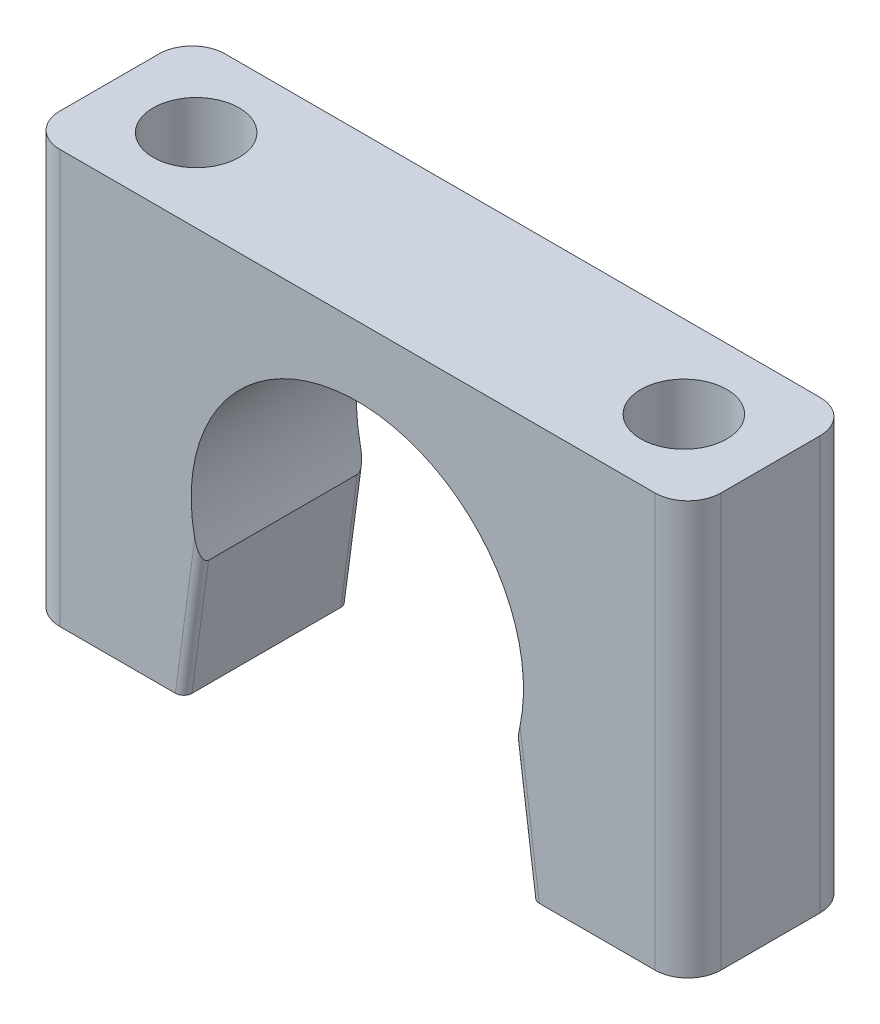
ISO-10303-21;
HEADER;
FILE_DESCRIPTION(('STEP AP214'),'2;1');
FILE_NAME('part.step','',(''),(''),'','','');
FILE_SCHEMA(('AUTOMOTIVE_DESIGN { 1 0 10303 214 1 1 1 1 }'));
ENDSEC;
DATA;
#1=APPLICATION_CONTEXT('core data for automotive mechanical design processes');
#2=APPLICATION_PROTOCOL_DEFINITION('international standard','automotive_design',2000,#1);
#3=PRODUCT_CONTEXT('',#1,'mechanical');
#4=PRODUCT('Part','Part','',(#3));
#5=PRODUCT_RELATED_PRODUCT_CATEGORY('part','',(#4));
#6=PRODUCT_DEFINITION_FORMATION('','',#4);
#7=PRODUCT_DEFINITION_CONTEXT('part definition',#1,'design');
#8=PRODUCT_DEFINITION('design','',#6,#7);
#9=PRODUCT_DEFINITION_SHAPE('','',#8);
#10=(LENGTH_UNIT() NAMED_UNIT(*) SI_UNIT(.MILLI.,.METRE.));
#11=(NAMED_UNIT(*) PLANE_ANGLE_UNIT() SI_UNIT($,.RADIAN.));
#12=(NAMED_UNIT(*) SI_UNIT($,.STERADIAN.) SOLID_ANGLE_UNIT());
#13=UNCERTAINTY_MEASURE_WITH_UNIT(LENGTH_MEASURE(1.E-05),#10,'distance_accuracy_value','');
#14=(GEOMETRIC_REPRESENTATION_CONTEXT(3) GLOBAL_UNCERTAINTY_ASSIGNED_CONTEXT((#13)) GLOBAL_UNIT_ASSIGNED_CONTEXT((#10,
#11,#12)) REPRESENTATION_CONTEXT('',''));
#15=CARTESIAN_POINT('',(0.,0.,0.));
#16=DIRECTION('',(0.,0.,1.));
#17=DIRECTION('',(1.,0.,0.));
#18=AXIS2_PLACEMENT_3D('',#15,#16,#17);
#19=CARTESIAN_POINT('',(-20.,-10.75,10.));
#20=DIRECTION('',(0.,1.,0.));
#21=DIRECTION('',(0.,0.,1.));
#22=AXIS2_PLACEMENT_3D('',#19,#20,#21);
#23=PLANE('',#22);
#24=CARTESIAN_POINT('',(-14.75,-10.75,5.));
#25=DIRECTION('',(0.,-1.,0.));
#26=DIRECTION('',(1.,0.,0.));
#27=AXIS2_PLACEMENT_3D('',#24,#25,#26);
#28=CIRCLE('',#27,2.6);
#29=CARTESIAN_POINT('',(-12.15,-10.75,5.));
#30=VERTEX_POINT('',#29);
#31=EDGE_CURVE('E271',#30,#30,#28,.T.);
#32=ORIENTED_EDGE('',*,*,#31,.F.);
#33=EDGE_LOOP('',(#32));
#34=FACE_BOUND('',#33,.T.);
#35=DIRECTION('',(1.,0.,0.));
#36=VECTOR('',#35,1.);
#37=CARTESIAN_POINT('',(-20.,-10.75,0.));
#38=LINE('',#37,#36);
#39=CARTESIAN_POINT('',(-18.,-10.75,0.));
#40=VERTEX_POINT('',#39);
#41=CARTESIAN_POINT('',(-11.004459250768,-10.75,0.));
#42=VERTEX_POINT('',#41);
#43=EDGE_CURVE('E273',#40,#42,#38,.T.);
#44=ORIENTED_EDGE('',*,*,#43,.T.);
#45=CARTESIAN_POINT('',(-11.004459250768,-10.75,0.5));
#46=DIRECTION('',(0.,1.,0.));
#47=DIRECTION('',(-1.,0.,0.));
#48=AXIS2_PLACEMENT_3D('',#45,#46,#47);
#49=ELLIPSE('',#48,0.504459250767987,0.5);
#50=CARTESIAN_POINT('',(-10.5,-10.75,0.5));
#51=VERTEX_POINT('',#50);
#52=EDGE_CURVE('E57',#42,#51,#49,.F.);
#53=ORIENTED_EDGE('',*,*,#52,.T.);
#54=DIRECTION('',(0.,0.,1.));
#55=VECTOR('',#54,1.);
#56=CARTESIAN_POINT('',(-10.5,-10.75,0.));
#57=LINE('',#56,#55);
#58=CARTESIAN_POINT('',(-10.5,-10.75,9.5));
#59=VERTEX_POINT('',#58);
#60=EDGE_CURVE('E327',#51,#59,#57,.T.);
#61=ORIENTED_EDGE('',*,*,#60,.T.);
#62=CARTESIAN_POINT('',(-11.004459250768,-10.75,9.5));
#63=DIRECTION('',(0.,1.,0.));
#64=DIRECTION('',(1.,0.,0.));
#65=AXIS2_PLACEMENT_3D('',#62,#63,#64);
#66=ELLIPSE('',#65,0.504459250767987,0.5);
#67=CARTESIAN_POINT('',(-11.004459250768,-10.75,10.));
#68=VERTEX_POINT('',#67);
#69=EDGE_CURVE('E49',#59,#68,#66,.F.);
#70=ORIENTED_EDGE('',*,*,#69,.T.);
#71=DIRECTION('',(1.,0.,0.));
#72=VECTOR('',#71,1.);
#73=CARTESIAN_POINT('',(-20.,-10.75,10.));
#74=LINE('',#73,#72);
#75=CARTESIAN_POINT('',(-18.,-10.75,10.));
#76=VERTEX_POINT('',#75);
#77=EDGE_CURVE('E293',#76,#68,#74,.T.);
#78=ORIENTED_EDGE('',*,*,#77,.F.);
#79=CARTESIAN_POINT('',(-18.,-10.75,8.));
#80=DIRECTION('',(0.,1.,0.));
#81=DIRECTION('',(0.,0.,1.));
#82=AXIS2_PLACEMENT_3D('',#79,#80,#81);
#83=CIRCLE('',#82,2.);
#84=CARTESIAN_POINT('',(-20.,-10.75,8.));
#85=VERTEX_POINT('',#84);
#86=EDGE_CURVE('E206',#76,#85,#83,.F.);
#87=ORIENTED_EDGE('',*,*,#86,.T.);
#88=DIRECTION('',(0.,0.,-1.));
#89=VECTOR('',#88,1.);
#90=CARTESIAN_POINT('',(-20.,-10.75,10.));
#91=LINE('',#90,#89);
#92=CARTESIAN_POINT('',(-20.,-10.75,2.));
#93=VERTEX_POINT('',#92);
#94=EDGE_CURVE('E294',#85,#93,#91,.T.);
#95=ORIENTED_EDGE('',*,*,#94,.T.);
#96=CARTESIAN_POINT('',(-18.,-10.75,2.));
#97=DIRECTION('',(0.,1.,0.));
#98=DIRECTION('',(0.,0.,1.));
#99=AXIS2_PLACEMENT_3D('',#96,#97,#98);
#100=CIRCLE('',#99,2.);
#101=EDGE_CURVE('E208',#93,#40,#100,.F.);
#102=ORIENTED_EDGE('',*,*,#101,.T.);
#103=EDGE_LOOP('',(#44,#53,#61,#70,#78,#87,#95,#102));
#104=FACE_BOUND('',#103,.T.);
#105=ADVANCED_FACE('F33',(#34,#104),#23,.F.);
#106=CARTESIAN_POINT('',(0.,0.,10.));
#107=DIRECTION('',(0.,0.,-1.));
#108=DIRECTION('',(-1.,0.,0.));
#109=AXIS2_PLACEMENT_3D('',#106,#107,#108);
#110=CYLINDRICAL_SURFACE('',#109,10.05);
#111=DIRECTION('',(0.,0.,-1.));
#112=VECTOR('',#111,1.);
#113=CARTESIAN_POINT('',(9.5,-3.27910048641391,10.));
#114=LINE('',#113,#112);
#115=CARTESIAN_POINT('',(9.5,-3.27910048641391,9.5));
#116=VERTEX_POINT('',#115);
#117=CARTESIAN_POINT('',(9.5,-3.27910048641391,0.5));
#118=VERTEX_POINT('',#117);
#119=EDGE_CURVE('E181',#116,#118,#114,.T.);
#120=ORIENTED_EDGE('',*,*,#119,.F.);
#121=CARTESIAN_POINT('',(9.5,-3.27910048641391,9.5));
#122=CARTESIAN_POINT('',(9.49998790671748,-3.27913316372702,9.51372534374378));
#123=CARTESIAN_POINT('',(9.50041030015473,-3.27791188653115,9.52740611635836));
#124=CARTESIAN_POINT('',(9.50201354953025,-3.27326264925061,9.55419190295349));
#125=CARTESIAN_POINT('',(9.50318597417995,-3.26985921835856,9.56730160814837));
#126=CARTESIAN_POINT('',(9.50652691985815,-3.2601343519518,9.59569952276108));
#127=CARTESIAN_POINT('',(9.50886227788309,-3.25332253900196,9.61079733503215));
#128=CARTESIAN_POINT('',(9.51427360118032,-3.23746334044807,9.63967133468617));
#129=CARTESIAN_POINT('',(9.51735289817296,-3.22840589287224,9.65344117520825));
#130=CARTESIAN_POINT('',(9.52589825161446,-3.20312715234871,9.68692330463747));
#131=CARTESIAN_POINT('',(9.53173536845415,-3.18573412128364,9.70564641602022));
#132=CARTESIAN_POINT('',(9.54409715914862,-3.14850722177467,9.74016843318304));
#133=CARTESIAN_POINT('',(9.5506232127815,-3.12866844121554,9.75596128909435));
#134=CARTESIAN_POINT('',(9.56378659448417,-3.08819076170209,9.78458290250436));
#135=CARTESIAN_POINT('',(9.57041075993641,-3.06760905108045,9.79750004627292));
#136=CARTESIAN_POINT('',(9.58382784219067,-3.0254315345143,9.82147299756049));
#137=CARTESIAN_POINT('',(9.59062091321052,-3.00383478448872,9.832527026573));
#138=CARTESIAN_POINT('',(9.61110479314627,-2.93790341987511,9.86338335130602));
#139=CARTESIAN_POINT('',(9.62487742882602,-2.8924975538443,9.88083429173306));
#140=CARTESIAN_POINT('',(9.65391533866754,-2.79417027429258,9.91307361387059));
#141=CARTESIAN_POINT('',(9.66914230546211,-2.74103836291234,9.92722234704051));
#142=CARTESIAN_POINT('',(9.6989657052255,-2.63356786409729,9.9510726919415));
#143=CARTESIAN_POINT('',(9.71356134241276,-2.5792278773649,9.9607688311759));
#144=CARTESIAN_POINT('',(9.74195527110588,-2.46981889444103,9.97661751859578));
#145=CARTESIAN_POINT('',(9.75575318921508,-2.41474957144913,9.98276841921504));
#146=CARTESIAN_POINT('',(9.78246529527098,-2.30415056021506,9.99215968215052));
#147=CARTESIAN_POINT('',(9.79537938279366,-2.2486208204597,9.99539971422889));
#148=CARTESIAN_POINT('',(9.81328579092678,-2.16853600687063,9.99829615251529));
#149=CARTESIAN_POINT('',(9.81865483182815,-2.14409509894796,9.99894324196794));
#150=CARTESIAN_POINT('',(9.82919753406424,-2.09523237287896,9.99979440023426));
#151=CARTESIAN_POINT('',(9.83437168315515,-2.07081068093855,9.99999965882678));
#152=CARTESIAN_POINT('',(9.83945487780237,-2.04636939668552,10.));
#153=B_SPLINE_CURVE_WITH_KNOTS('',3,(#121,#122,#123,#124,#125,#126,#127,#128,#129,#130,#131,
#132,#133,#134,#135,#136,#137,#138,#139,#140,#141,#142,#143,#144,#145,#146,#147,#148,#149,#150,
#151,#152),.UNSPECIFIED.,.F.,.F.,(4,2,2,2,2,2,2,2,2,2,2,2,2,2,2,4),(0.,0.0410432505747204,
0.0816330425823074,0.13153684270174,0.18166842004176,0.259866945468589,0.338225167138012,
0.413669487935746,0.489185424005445,0.640474285918973,0.811401163055235,0.982537560661458,
1.15375342588844,1.32498871309231,1.40008139095695,1.47497160213267),.UNSPECIFIED.);
#154=CARTESIAN_POINT('',(9.83945487780237,-2.04636939668552,10.));
#155=VERTEX_POINT('',#154);
#156=EDGE_CURVE('E244',#116,#155,#153,.T.);
#157=ORIENTED_EDGE('',*,*,#156,.T.);
#158=CARTESIAN_POINT('',(0.,0.,10.));
#159=DIRECTION('',(0.,0.,-1.));
#160=DIRECTION('',(1.,0.,0.));
#161=AXIS2_PLACEMENT_3D('',#158,#159,#160);
#162=CIRCLE('',#161,10.05);
#163=CARTESIAN_POINT('',(-9.83945487780237,-2.04636939668551,10.));
#164=VERTEX_POINT('',#163);
#165=EDGE_CURVE('E344',#164,#155,#162,.T.);
#166=ORIENTED_EDGE('',*,*,#165,.F.);
#167=CARTESIAN_POINT('',(-9.83945487780237,-2.04636939668551,10.));
#168=CARTESIAN_POINT('',(-9.82689287255356,-2.10678373649763,9.9999688619861));
#169=CARTESIAN_POINT('',(-9.81376299556602,-2.16711170176037,9.9987391228412));
#170=CARTESIAN_POINT('',(-9.78637742552928,-2.28760438592438,9.99327890987156));
#171=CARTESIAN_POINT('',(-9.77211776204025,-2.347767683996,9.9890373947442));
#172=CARTESIAN_POINT('',(-9.74266098100099,-2.46714775672689,9.97697630622118));
#173=CARTESIAN_POINT('',(-9.72746972832768,-2.52636798545276,9.96917745695797));
#174=CARTESIAN_POINT('',(-9.69622395214052,-2.64375037325262,9.94911813473575));
#175=CARTESIAN_POINT('',(-9.68017090937881,-2.70191413105831,9.93686511834777));
#176=CARTESIAN_POINT('',(-9.65423213761228,-2.79276212778526,9.91279973236236));
#177=CARTESIAN_POINT('',(-9.64454990415788,-2.82600886140964,9.90291231627503));
#178=CARTESIAN_POINT('',(-9.62502140542735,-2.89182478534859,9.88064420577114));
#179=CARTESIAN_POINT('',(-9.6151745304631,-2.92438923618497,9.86825008079128));
#180=CARTESIAN_POINT('',(-9.59224225415447,-2.99889134294011,9.83580134353254));
#181=CARTESIAN_POINT('',(-9.57916519492212,-3.04035831008542,9.81456926728568));
#182=CARTESIAN_POINT('',(-9.56025654380345,-3.09910017874477,9.77720428699389));
#183=CARTESIAN_POINT('',(-9.55409038046742,-3.1180483633034,9.76388194027836));
#184=CARTESIAN_POINT('',(-9.54218182108432,-3.154302713136,9.73502553052636));
#185=CARTESIAN_POINT('',(-9.53643844782512,-3.17161269314652,9.71949682745566));
#186=CARTESIAN_POINT('',(-9.52732699994715,-3.19885609019244,9.69097290152354));
#187=CARTESIAN_POINT('',(-9.52376926569638,-3.20942760505898,9.67865277517425));
#188=CARTESIAN_POINT('',(-9.51716490572398,-3.22895929539167,9.65262861625089));
#189=CARTESIAN_POINT('',(-9.51411866658142,-3.23791825247954,9.63892354938187));
#190=CARTESIAN_POINT('',(-9.50871779825588,-3.25374508252056,9.60994267876574));
#191=CARTESIAN_POINT('',(-9.50637351165849,-3.26058173448216,9.5946474747869));
#192=CARTESIAN_POINT('',(-9.50270520108838,-3.27125771002962,9.56294548994908));
#193=CARTESIAN_POINT('',(-9.50137696120834,-3.27510941998869,9.5465436130279));
#194=CARTESIAN_POINT('',(-9.50043504891646,-3.27783984453272,9.52496497354879));
#195=CARTESIAN_POINT('',(-9.50027225057644,-3.27831164170563,9.51998624689404));
#196=CARTESIAN_POINT('',(-9.50005479386851,-3.27894176252967,9.51000594215666));
#197=CARTESIAN_POINT('',(-9.50000015094776,-3.27910004140301,9.50500436091209));
#198=CARTESIAN_POINT('',(-9.5,-3.27910048641395,9.50000000000001));
#199=B_SPLINE_CURVE_WITH_KNOTS('',3,(#167,#168,#169,#170,#171,#172,#173,#174,#175,#176,#177,
#178,#179,#180,#181,#182,#183,#184,#185,#186,#187,#188,#189,#190,#191,#192,#193,#194,#195,#196,
#197,#198),.UNSPECIFIED.,.F.,.F.,(4,2,2,2,2,2,2,2,2,2,2,2,2,2,2,4),(0.,0.185153588946186,
0.370989487078372,0.55575631321418,0.740215241244101,0.848170250899866,0.956719765882345,
1.10124745107238,1.17304630294399,1.24467362292246,1.29442109380783,1.34420599536025,
1.39469192029021,1.44496720909608,1.45996989148548,1.47497471645699),.UNSPECIFIED.);
#200=CARTESIAN_POINT('',(-9.5,-3.27910048641391,9.5));
#201=VERTEX_POINT('',#200);
#202=EDGE_CURVE('E215',#164,#201,#199,.T.);
#203=ORIENTED_EDGE('',*,*,#202,.T.);
#204=DIRECTION('',(0.,0.,-1.));
#205=VECTOR('',#204,1.);
#206=CARTESIAN_POINT('',(-9.5,-3.27910048641391,10.));
#207=LINE('',#206,#205);
#208=CARTESIAN_POINT('',(-9.5,-3.27910048641391,0.5));
#209=VERTEX_POINT('',#208);
#210=EDGE_CURVE('E176',#201,#209,#207,.T.);
#211=ORIENTED_EDGE('',*,*,#210,.T.);
#212=CARTESIAN_POINT('',(-9.5,-3.27910048641391,0.5));
#213=CARTESIAN_POINT('',(-9.49998790671748,-3.27913316372702,0.486274656256216));
#214=CARTESIAN_POINT('',(-9.50041030015473,-3.27791188653115,0.472593883641635));
#215=CARTESIAN_POINT('',(-9.50201354953025,-3.2732626492506,0.445808097046511));
#216=CARTESIAN_POINT('',(-9.50318597417995,-3.26985921835855,0.432698391851632));
#217=CARTESIAN_POINT('',(-9.50652691985816,-3.26013435195179,0.404300477238918));
#218=CARTESIAN_POINT('',(-9.5088622778831,-3.25332253900196,0.389202664967854));
#219=CARTESIAN_POINT('',(-9.51427360118033,-3.23746334044806,0.360328665313829));
#220=CARTESIAN_POINT('',(-9.51735289817296,-3.22840589287224,0.346558824791753));
#221=CARTESIAN_POINT('',(-9.52589825161446,-3.20312715234871,0.313076695362534));
#222=CARTESIAN_POINT('',(-9.53173536845415,-3.18573412128363,0.294353583979787));
#223=CARTESIAN_POINT('',(-9.54409715914862,-3.14850722177466,0.259831566816961));
#224=CARTESIAN_POINT('',(-9.5506232127815,-3.12866844121553,0.244038710905652));
#225=CARTESIAN_POINT('',(-9.56378659448417,-3.08819076170209,0.215417097495638));
#226=CARTESIAN_POINT('',(-9.57041075993641,-3.06760905108044,0.202499953727085));
#227=CARTESIAN_POINT('',(-9.58382784219067,-3.0254315345143,0.17852700243951));
#228=CARTESIAN_POINT('',(-9.59062091321052,-3.00383478448872,0.167472973427007));
#229=CARTESIAN_POINT('',(-9.61110479314627,-2.9379034198751,0.136616648693988));
#230=CARTESIAN_POINT('',(-9.62487742882602,-2.8924975538443,0.119165708266946));
#231=CARTESIAN_POINT('',(-9.65391533866754,-2.79417027429258,0.0869263861294149));
#232=CARTESIAN_POINT('',(-9.66914230546211,-2.74103836291234,0.0727776529594946));
#233=CARTESIAN_POINT('',(-9.6989657052255,-2.63356786409729,0.0489273080585019));
#234=CARTESIAN_POINT('',(-9.71356134241276,-2.5792278773649,0.0392311688241016));
#235=CARTESIAN_POINT('',(-9.74195527110588,-2.46981889444103,0.0233824814042255));
#236=CARTESIAN_POINT('',(-9.75575318921508,-2.41474957144913,0.0172315807849641));
#237=CARTESIAN_POINT('',(-9.78246529527098,-2.30415056021507,0.00784031784948217));
#238=CARTESIAN_POINT('',(-9.79537938279366,-2.24862082045971,0.00460028577111025));
#239=CARTESIAN_POINT('',(-9.81328579092678,-2.16853600687064,0.00170384748470681));
#240=CARTESIAN_POINT('',(-9.81865483182815,-2.14409509894796,0.00105675803205909));
#241=CARTESIAN_POINT('',(-9.82919753406424,-2.09523237287896,0.000205599765735223));
#242=CARTESIAN_POINT('',(-9.83437168315515,-2.07081068093854,3.41173226165158E-07));
#243=CARTESIAN_POINT('',(-9.83945487780237,-2.04636939668551,0.));
#244=B_SPLINE_CURVE_WITH_KNOTS('',3,(#212,#213,#214,#215,#216,#217,#218,#219,#220,#221,#222,
#223,#224,#225,#226,#227,#228,#229,#230,#231,#232,#233,#234,#235,#236,#237,#238,#239,#240,#241,
#242,#243),.UNSPECIFIED.,.F.,.F.,(4,2,2,2,2,2,2,2,2,2,2,2,2,2,2,4),(0.,0.0410432505747221,
0.0816330425823075,0.131536842701741,0.18166842004176,0.259866945468588,0.338225167138009,
0.413669487935741,0.48918542400544,0.640474285918965,0.811401163055226,0.982537560661448,
1.15375342588843,1.3249887130923,1.40008139095695,1.47497160213267),.UNSPECIFIED.);
#245=CARTESIAN_POINT('',(-9.83945487780237,-2.04636939668551,0.));
#246=VERTEX_POINT('',#245);
#247=EDGE_CURVE('E221',#209,#246,#244,.T.);
#248=ORIENTED_EDGE('',*,*,#247,.T.);
#249=CARTESIAN_POINT('',(0.,0.,0.));
#250=DIRECTION('',(0.,0.,-1.));
#251=DIRECTION('',(1.,0.,0.));
#252=AXIS2_PLACEMENT_3D('',#249,#250,#251);
#253=CIRCLE('',#252,10.05);
#254=CARTESIAN_POINT('',(9.83945487780237,-2.04636939668552,0.));
#255=VERTEX_POINT('',#254);
#256=EDGE_CURVE('E278',#246,#255,#253,.T.);
#257=ORIENTED_EDGE('',*,*,#256,.T.);
#258=CARTESIAN_POINT('',(9.83945487780237,-2.04636939668552,0.));
#259=CARTESIAN_POINT('',(9.82689287255356,-2.10678373649764,3.11380139014351E-05));
#260=CARTESIAN_POINT('',(9.81376299556601,-2.16711170176038,0.00126087715880306));
#261=CARTESIAN_POINT('',(9.78637742552928,-2.28760438592438,0.0067210901284361));
#262=CARTESIAN_POINT('',(9.77211776204025,-2.347767683996,0.0109626052558032));
#263=CARTESIAN_POINT('',(9.74266098100099,-2.46714775672689,0.0230236937788195));
#264=CARTESIAN_POINT('',(9.72746972832768,-2.52636798545276,0.030822543042026));
#265=CARTESIAN_POINT('',(9.69622395214052,-2.64375037325262,0.0508818652642507));
#266=CARTESIAN_POINT('',(9.68017090937881,-2.70191413105831,0.0631348816522322));
#267=CARTESIAN_POINT('',(9.65423213761228,-2.79276212778527,0.0872002676376376));
#268=CARTESIAN_POINT('',(9.64454990415787,-2.82600886140965,0.0970876837249674));
#269=CARTESIAN_POINT('',(9.62502140542735,-2.89182478534859,0.119355794228859));
#270=CARTESIAN_POINT('',(9.6151745304631,-2.92438923618498,0.131749919208722));
#271=CARTESIAN_POINT('',(9.59224225415446,-2.99889134294012,0.164198656467458));
#272=CARTESIAN_POINT('',(9.57916519492212,-3.04035831008542,0.185430732714321));
#273=CARTESIAN_POINT('',(9.56025654380345,-3.09910017874477,0.222795713006106));
#274=CARTESIAN_POINT('',(9.55409038046742,-3.1180483633034,0.236118059721634));
#275=CARTESIAN_POINT('',(9.54218182108432,-3.154302713136,0.264974469473639));
#276=CARTESIAN_POINT('',(9.53643844782512,-3.17161269314652,0.280503172544334));
#277=CARTESIAN_POINT('',(9.52732699994715,-3.19885609019244,0.309027098476459));
#278=CARTESIAN_POINT('',(9.52376926569638,-3.20942760505898,0.321347224825745));
#279=CARTESIAN_POINT('',(9.51716490572398,-3.22895929539167,0.347371383749108));
#280=CARTESIAN_POINT('',(9.51411866658142,-3.23791825247955,0.361076450618122));
#281=CARTESIAN_POINT('',(9.50871779825588,-3.25374508252056,0.390057321234257));
#282=CARTESIAN_POINT('',(9.50637351165849,-3.26058173448216,0.405352525213093));
#283=CARTESIAN_POINT('',(9.50270520108838,-3.27125771002962,0.43705451005092));
#284=CARTESIAN_POINT('',(9.50137696120834,-3.27510941998869,0.453456386972097));
#285=CARTESIAN_POINT('',(9.50043504891646,-3.27783984453272,0.475035026451206));
#286=CARTESIAN_POINT('',(9.50027225057644,-3.27831164170563,0.480013753105957));
#287=CARTESIAN_POINT('',(9.50005479386851,-3.27894176252968,0.489994057843337));
#288=CARTESIAN_POINT('',(9.50000015094776,-3.27910004140302,0.494995639087909));
#289=CARTESIAN_POINT('',(9.5,-3.27910048641396,0.499999999999994));
#290=B_SPLINE_CURVE_WITH_KNOTS('',3,(#258,#259,#260,#261,#262,#263,#264,#265,#266,#267,#268,
#269,#270,#271,#272,#273,#274,#275,#276,#277,#278,#279,#280,#281,#282,#283,#284,#285,#286,#287,
#288,#289),.UNSPECIFIED.,.F.,.F.,(4,2,2,2,2,2,2,2,2,2,2,2,2,2,2,4),(0.,0.185153588946184,
0.370989487078369,0.555756313214177,0.740215241244099,0.848170250899866,0.956719765882346,
1.10124745107238,1.17304630294398,1.24467362292245,1.29442109380782,1.34420599536024,
1.3946919202902,1.44496720909607,1.45996989148547,1.47497471645699),.UNSPECIFIED.);
#291=EDGE_CURVE('E239',#255,#118,#290,.T.);
#292=ORIENTED_EDGE('',*,*,#291,.T.);
#293=EDGE_LOOP('',(#120,#157,#166,#203,#211,#248,#257,#292));
#294=FACE_BOUND('',#293,.T.);
#295=ADVANCED_FACE('F226',(#294),#110,.F.);
#296=CARTESIAN_POINT('',(9.5,-10.75,10.));
#297=DIRECTION('',(0.,1.,0.));
#298=DIRECTION('',(-1.,0.,0.));
#299=AXIS2_PLACEMENT_3D('',#296,#297,#298);
#300=PLANE('',#299);
#301=CARTESIAN_POINT('',(14.75,-10.75,5.));
#302=DIRECTION('',(0.,-1.,0.));
#303=DIRECTION('',(1.,0.,0.));
#304=AXIS2_PLACEMENT_3D('',#301,#302,#303);
#305=CIRCLE('',#304,2.6);
#306=CARTESIAN_POINT('',(17.35,-10.75,5.));
#307=VERTEX_POINT('',#306);
#308=EDGE_CURVE('E332',#307,#307,#305,.T.);
#309=ORIENTED_EDGE('',*,*,#308,.F.);
#310=EDGE_LOOP('',(#309));
#311=FACE_BOUND('',#310,.T.);
#312=DIRECTION('',(1.,0.,0.));
#313=VECTOR('',#312,1.);
#314=CARTESIAN_POINT('',(9.5,-10.75,10.));
#315=LINE('',#314,#313);
#316=CARTESIAN_POINT('',(11.004459250768,-10.75,10.));
#317=VERTEX_POINT('',#316);
#318=CARTESIAN_POINT('',(18.,-10.75,10.));
#319=VERTEX_POINT('',#318);
#320=EDGE_CURVE('E346',#317,#319,#315,.T.);
#321=ORIENTED_EDGE('',*,*,#320,.F.);
#322=CARTESIAN_POINT('',(11.004459250768,-10.75,9.5));
#323=DIRECTION('',(0.,1.,0.));
#324=DIRECTION('',(1.,0.,0.));
#325=AXIS2_PLACEMENT_3D('',#322,#323,#324);
#326=ELLIPSE('',#325,0.504459250767987,0.5);
#327=CARTESIAN_POINT('',(10.5,-10.75,9.5));
#328=VERTEX_POINT('',#327);
#329=EDGE_CURVE('E313',#317,#328,#326,.F.);
#330=ORIENTED_EDGE('',*,*,#329,.T.);
#331=DIRECTION('',(0.,0.,1.));
#332=VECTOR('',#331,1.);
#333=CARTESIAN_POINT('',(10.5,-10.75,0.));
#334=LINE('',#333,#332);
#335=CARTESIAN_POINT('',(10.5,-10.75,0.5));
#336=VERTEX_POINT('',#335);
#337=EDGE_CURVE('E333',#336,#328,#334,.T.);
#338=ORIENTED_EDGE('',*,*,#337,.F.);
#339=CARTESIAN_POINT('',(11.004459250768,-10.75,0.5));
#340=DIRECTION('',(0.,1.,0.));
#341=DIRECTION('',(-1.,0.,0.));
#342=AXIS2_PLACEMENT_3D('',#339,#340,#341);
#343=ELLIPSE('',#342,0.504459250767987,0.5);
#344=CARTESIAN_POINT('',(11.004459250768,-10.75,0.));
#345=VERTEX_POINT('',#344);
#346=EDGE_CURVE('E309',#336,#345,#343,.F.);
#347=ORIENTED_EDGE('',*,*,#346,.T.);
#348=DIRECTION('',(1.,0.,0.));
#349=VECTOR('',#348,1.);
#350=CARTESIAN_POINT('',(9.5,-10.75,0.));
#351=LINE('',#350,#349);
#352=CARTESIAN_POINT('',(18.,-10.75,0.));
#353=VERTEX_POINT('',#352);
#354=EDGE_CURVE('E282',#345,#353,#351,.T.);
#355=ORIENTED_EDGE('',*,*,#354,.T.);
#356=CARTESIAN_POINT('',(18.,-10.75,2.));
#357=DIRECTION('',(0.,1.,0.));
#358=DIRECTION('',(-1.,0.,0.));
#359=AXIS2_PLACEMENT_3D('',#356,#357,#358);
#360=CIRCLE('',#359,2.);
#361=CARTESIAN_POINT('',(20.,-10.75,2.));
#362=VERTEX_POINT('',#361);
#363=EDGE_CURVE('E194',#353,#362,#360,.F.);
#364=ORIENTED_EDGE('',*,*,#363,.T.);
#365=DIRECTION('',(0.,0.,-1.));
#366=VECTOR('',#365,1.);
#367=CARTESIAN_POINT('',(20.,-10.75,10.));
#368=LINE('',#367,#366);
#369=CARTESIAN_POINT('',(20.,-10.75,8.));
#370=VERTEX_POINT('',#369);
#371=EDGE_CURVE('E169',#370,#362,#368,.T.);
#372=ORIENTED_EDGE('',*,*,#371,.F.);
#373=CARTESIAN_POINT('',(18.,-10.75,8.));
#374=DIRECTION('',(0.,1.,0.));
#375=DIRECTION('',(-1.,0.,0.));
#376=AXIS2_PLACEMENT_3D('',#373,#374,#375);
#377=CIRCLE('',#376,2.);
#378=EDGE_CURVE('E175',#370,#319,#377,.F.);
#379=ORIENTED_EDGE('',*,*,#378,.T.);
#380=EDGE_LOOP('',(#321,#330,#338,#347,#355,#364,#372,#379));
#381=FACE_BOUND('',#380,.T.);
#382=ADVANCED_FACE('F231',(#311,#381),#300,.F.);
#383=CARTESIAN_POINT('',(20.,-10.75,10.));
#384=DIRECTION('',(-1.,0.,0.));
#385=DIRECTION('',(0.,-1.,0.));
#386=AXIS2_PLACEMENT_3D('',#383,#384,#385);
#387=PLANE('',#386);
#388=ORIENTED_EDGE('',*,*,#371,.T.);
#389=DIRECTION('',(0.,1.,0.));
#390=VECTOR('',#389,1.);
#391=CARTESIAN_POINT('',(20.,-10.75,2.));
#392=LINE('',#391,#390);
#393=CARTESIAN_POINT('',(20.,14.25,2.));
#394=VERTEX_POINT('',#393);
#395=EDGE_CURVE('E168',#362,#394,#392,.T.);
#396=ORIENTED_EDGE('',*,*,#395,.T.);
#397=DIRECTION('',(0.,0.,-1.));
#398=VECTOR('',#397,1.);
#399=CARTESIAN_POINT('',(20.,14.25,10.));
#400=LINE('',#399,#398);
#401=CARTESIAN_POINT('',(20.,14.25,8.));
#402=VERTEX_POINT('',#401);
#403=EDGE_CURVE('E151',#402,#394,#400,.T.);
#404=ORIENTED_EDGE('',*,*,#403,.F.);
#405=DIRECTION('',(0.,1.,0.));
#406=VECTOR('',#405,1.);
#407=CARTESIAN_POINT('',(20.,-10.75,8.));
#408=LINE('',#407,#406);
#409=EDGE_CURVE('E165',#402,#370,#408,.F.);
#410=ORIENTED_EDGE('',*,*,#409,.T.);
#411=EDGE_LOOP('',(#388,#396,#404,#410));
#412=FACE_BOUND('',#411,.T.);
#413=ADVANCED_FACE('F164',(#412),#387,.F.);
#414=CARTESIAN_POINT('',(-20.,14.25,10.));
#415=DIRECTION('',(0.,-1.,0.));
#416=DIRECTION('',(0.,0.,-1.));
#417=AXIS2_PLACEMENT_3D('',#414,#415,#416);
#418=PLANE('',#417);
#419=CARTESIAN_POINT('',(14.75,14.25,5.));
#420=DIRECTION('',(0.,-1.,0.));
#421=DIRECTION('',(1.,0.,0.));
#422=AXIS2_PLACEMENT_3D('',#419,#420,#421);
#423=CIRCLE('',#422,2.6);
#424=CARTESIAN_POINT('',(17.35,14.25,5.));
#425=VERTEX_POINT('',#424);
#426=EDGE_CURVE('E336',#425,#425,#423,.T.);
#427=ORIENTED_EDGE('',*,*,#426,.T.);
#428=EDGE_LOOP('',(#427));
#429=FACE_BOUND('',#428,.T.);
#430=CARTESIAN_POINT('',(-14.75,14.25,5.));
#431=DIRECTION('',(0.,-1.,0.));
#432=DIRECTION('',(1.,0.,0.));
#433=AXIS2_PLACEMENT_3D('',#430,#431,#432);
#434=CIRCLE('',#433,2.6);
#435=CARTESIAN_POINT('',(-12.15,14.25,5.));
#436=VERTEX_POINT('',#435);
#437=EDGE_CURVE('E279',#436,#436,#434,.T.);
#438=ORIENTED_EDGE('',*,*,#437,.T.);
#439=EDGE_LOOP('',(#438));
#440=FACE_BOUND('',#439,.T.);
#441=ORIENTED_EDGE('',*,*,#403,.T.);
#442=CARTESIAN_POINT('',(18.,14.25,2.));
#443=DIRECTION('',(0.,-1.,0.));
#444=DIRECTION('',(0.,0.,-1.));
#445=AXIS2_PLACEMENT_3D('',#442,#443,#444);
#446=CIRCLE('',#445,2.);
#447=CARTESIAN_POINT('',(18.,14.25,0.));
#448=VERTEX_POINT('',#447);
#449=EDGE_CURVE('E158',#394,#448,#446,.F.);
#450=ORIENTED_EDGE('',*,*,#449,.T.);
#451=DIRECTION('',(-1.,0.,0.));
#452=VECTOR('',#451,1.);
#453=CARTESIAN_POINT('',(-20.,14.25,0.));
#454=LINE('',#453,#452);
#455=CARTESIAN_POINT('',(-18.,14.25,0.));
#456=VERTEX_POINT('',#455);
#457=EDGE_CURVE('E290',#448,#456,#454,.T.);
#458=ORIENTED_EDGE('',*,*,#457,.T.);
#459=CARTESIAN_POINT('',(-18.,14.25,2.));
#460=DIRECTION('',(0.,-1.,0.));
#461=DIRECTION('',(0.,0.,-1.));
#462=AXIS2_PLACEMENT_3D('',#459,#460,#461);
#463=CIRCLE('',#462,2.);
#464=CARTESIAN_POINT('',(-20.,14.25,2.));
#465=VERTEX_POINT('',#464);
#466=EDGE_CURVE('E159',#456,#465,#463,.F.);
#467=ORIENTED_EDGE('',*,*,#466,.T.);
#468=DIRECTION('',(0.,0.,-1.));
#469=VECTOR('',#468,1.);
#470=CARTESIAN_POINT('',(-20.,14.25,10.));
#471=LINE('',#470,#469);
#472=CARTESIAN_POINT('',(-20.,14.25,8.));
#473=VERTEX_POINT('',#472);
#474=EDGE_CURVE('E170',#473,#465,#471,.T.);
#475=ORIENTED_EDGE('',*,*,#474,.F.);
#476=CARTESIAN_POINT('',(-18.,14.25,8.));
#477=DIRECTION('',(0.,-1.,0.));
#478=DIRECTION('',(0.,0.,-1.));
#479=AXIS2_PLACEMENT_3D('',#476,#477,#478);
#480=CIRCLE('',#479,2.);
#481=CARTESIAN_POINT('',(-18.,14.25,10.));
#482=VERTEX_POINT('',#481);
#483=EDGE_CURVE('E178',#473,#482,#480,.F.);
#484=ORIENTED_EDGE('',*,*,#483,.T.);
#485=DIRECTION('',(-1.,0.,0.));
#486=VECTOR('',#485,1.);
#487=CARTESIAN_POINT('',(-20.,14.25,10.));
#488=LINE('',#487,#486);
#489=CARTESIAN_POINT('',(18.,14.25,10.));
#490=VERTEX_POINT('',#489);
#491=EDGE_CURVE('E153',#490,#482,#488,.T.);
#492=ORIENTED_EDGE('',*,*,#491,.F.);
#493=CARTESIAN_POINT('',(18.,14.25,8.));
#494=DIRECTION('',(0.,-1.,0.));
#495=DIRECTION('',(0.,0.,-1.));
#496=AXIS2_PLACEMENT_3D('',#493,#494,#495);
#497=CIRCLE('',#496,2.);
#498=EDGE_CURVE('E148',#490,#402,#497,.F.);
#499=ORIENTED_EDGE('',*,*,#498,.T.);
#500=EDGE_LOOP('',(#441,#450,#458,#467,#475,#484,#492,#499));
#501=FACE_BOUND('',#500,.T.);
#502=ADVANCED_FACE('F150',(#429,#440,#501),#418,.F.);
#503=CARTESIAN_POINT('',(-20.,-10.75,10.));
#504=DIRECTION('',(1.,0.,0.));
#505=DIRECTION('',(0.,1.,0.));
#506=AXIS2_PLACEMENT_3D('',#503,#504,#505);
#507=PLANE('',#506);
#508=ORIENTED_EDGE('',*,*,#474,.T.);
#509=DIRECTION('',(0.,-1.,0.));
#510=VECTOR('',#509,1.);
#511=CARTESIAN_POINT('',(-20.,-10.75,2.));
#512=LINE('',#511,#510);
#513=EDGE_CURVE('E203',#465,#93,#512,.T.);
#514=ORIENTED_EDGE('',*,*,#513,.T.);
#515=ORIENTED_EDGE('',*,*,#94,.F.);
#516=DIRECTION('',(0.,-1.,0.));
#517=VECTOR('',#516,1.);
#518=CARTESIAN_POINT('',(-20.,14.25,8.));
#519=LINE('',#518,#517);
#520=EDGE_CURVE('E201',#85,#473,#519,.F.);
#521=ORIENTED_EDGE('',*,*,#520,.T.);
#522=EDGE_LOOP('',(#508,#514,#515,#521));
#523=FACE_BOUND('',#522,.T.);
#524=ADVANCED_FACE('F357',(#523),#507,.F.);
#525=CARTESIAN_POINT('',(0.,0.,10.));
#526=DIRECTION('',(0.,0.,1.));
#527=DIRECTION('',(1.,0.,0.));
#528=AXIS2_PLACEMENT_3D('',#525,#526,#527);
#529=PLANE('',#528);
#530=ORIENTED_EDGE('',*,*,#165,.T.);
#531=DIRECTION('',(-0.132669477514345,0.991160335029641,0.));
#532=VECTOR('',#531,1.);
#533=CARTESIAN_POINT('',(10.9955801675148,-10.6836652612428,10.));
#534=LINE('',#533,#532);
#535=EDGE_CURVE('E314',#155,#317,#534,.F.);
#536=ORIENTED_EDGE('',*,*,#535,.T.);
#537=ORIENTED_EDGE('',*,*,#320,.T.);
#538=DIRECTION('',(0.,1.,0.));
#539=VECTOR('',#538,1.);
#540=CARTESIAN_POINT('',(18.,14.25,10.));
#541=LINE('',#540,#539);
#542=EDGE_CURVE('E199',#319,#490,#541,.T.);
#543=ORIENTED_EDGE('',*,*,#542,.T.);
#544=ORIENTED_EDGE('',*,*,#491,.T.);
#545=DIRECTION('',(0.,-1.,0.));
#546=VECTOR('',#545,1.);
#547=CARTESIAN_POINT('',(-18.,-10.75,10.));
#548=LINE('',#547,#546);
#549=EDGE_CURVE('E196',#482,#76,#548,.T.);
#550=ORIENTED_EDGE('',*,*,#549,.T.);
#551=ORIENTED_EDGE('',*,*,#77,.T.);
#552=DIRECTION('',(-0.132669477514345,-0.991160335029641,0.));
#553=VECTOR('',#552,1.);
#554=CARTESIAN_POINT('',(-9.99558016751482,-3.21276574765674,10.));
#555=LINE('',#554,#553);
#556=EDGE_CURVE('E318',#68,#164,#555,.F.);
#557=ORIENTED_EDGE('',*,*,#556,.T.);
#558=EDGE_LOOP('',(#530,#536,#537,#543,#544,#550,#551,#557));
#559=FACE_BOUND('',#558,.T.);
#560=ADVANCED_FACE('F350',(#559),#529,.T.);
#561=CARTESIAN_POINT('',(0.,0.,0.));
#562=DIRECTION('',(0.,0.,1.));
#563=DIRECTION('',(1.,0.,0.));
#564=AXIS2_PLACEMENT_3D('',#561,#562,#563);
#565=PLANE('',#564);
#566=ORIENTED_EDGE('',*,*,#354,.F.);
#567=DIRECTION('',(-0.132669477514345,0.991160335029641,0.));
#568=VECTOR('',#567,1.);
#569=CARTESIAN_POINT('',(9.39717788909431,1.25783754312385,0.));
#570=LINE('',#569,#568);
#571=EDGE_CURVE('E310',#345,#255,#570,.T.);
#572=ORIENTED_EDGE('',*,*,#571,.T.);
#573=ORIENTED_EDGE('',*,*,#256,.F.);
#574=DIRECTION('',(-0.132669477514345,-0.991160335029641,0.));
#575=VECTOR('',#574,1.);
#576=CARTESIAN_POINT('',(-9.39717788909432,1.25783754312385,0.));
#577=LINE('',#576,#575);
#578=EDGE_CURVE('E316',#246,#42,#577,.T.);
#579=ORIENTED_EDGE('',*,*,#578,.T.);
#580=ORIENTED_EDGE('',*,*,#43,.F.);
#581=DIRECTION('',(0.,-1.,0.));
#582=VECTOR('',#581,1.);
#583=CARTESIAN_POINT('',(-18.,0.,0.));
#584=LINE('',#583,#582);
#585=EDGE_CURVE('E188',#40,#456,#584,.F.);
#586=ORIENTED_EDGE('',*,*,#585,.T.);
#587=ORIENTED_EDGE('',*,*,#457,.F.);
#588=DIRECTION('',(0.,1.,0.));
#589=VECTOR('',#588,1.);
#590=CARTESIAN_POINT('',(18.,0.,0.));
#591=LINE('',#590,#589);
#592=EDGE_CURVE('E190',#448,#353,#591,.F.);
#593=ORIENTED_EDGE('',*,*,#592,.T.);
#594=EDGE_LOOP('',(#566,#572,#573,#579,#580,#586,#587,#593));
#595=FACE_BOUND('',#594,.T.);
#596=ADVANCED_FACE('F364',(#595),#565,.F.);
#597=CARTESIAN_POINT('',(-14.75,14.25,5.));
#598=DIRECTION('',(0.,-1.,0.));
#599=DIRECTION('',(1.,0.,0.));
#600=AXIS2_PLACEMENT_3D('',#597,#598,#599);
#601=CYLINDRICAL_SURFACE('',#600,2.6);
#602=ORIENTED_EDGE('',*,*,#437,.F.);
#603=EDGE_LOOP('',(#602));
#604=FACE_BOUND('',#603,.T.);
#605=ORIENTED_EDGE('',*,*,#31,.T.);
#606=EDGE_LOOP('',(#605));
#607=FACE_BOUND('',#606,.T.);
#608=ADVANCED_FACE('F388',(#604,#607),#601,.F.);
#609=CARTESIAN_POINT('',(14.75,14.25,5.));
#610=DIRECTION('',(0.,-1.,0.));
#611=DIRECTION('',(1.,0.,0.));
#612=AXIS2_PLACEMENT_3D('',#609,#610,#611);
#613=CYLINDRICAL_SURFACE('',#612,2.6);
#614=ORIENTED_EDGE('',*,*,#426,.F.);
#615=EDGE_LOOP('',(#614));
#616=FACE_BOUND('',#615,.T.);
#617=ORIENTED_EDGE('',*,*,#308,.T.);
#618=EDGE_LOOP('',(#617));
#619=FACE_BOUND('',#618,.T.);
#620=ADVANCED_FACE('F385',(#616,#619),#613,.F.);
#621=CARTESIAN_POINT('',(18.,-10.75,2.));
#622=DIRECTION('',(0.,1.,0.));
#623=DIRECTION('',(-1.,0.,0.));
#624=AXIS2_PLACEMENT_3D('',#621,#622,#623);
#625=CYLINDRICAL_SURFACE('',#624,2.);
#626=ORIENTED_EDGE('',*,*,#363,.F.);
#627=ORIENTED_EDGE('',*,*,#592,.F.);
#628=ORIENTED_EDGE('',*,*,#449,.F.);
#629=ORIENTED_EDGE('',*,*,#395,.F.);
#630=EDGE_LOOP('',(#626,#627,#628,#629));
#631=FACE_BOUND('',#630,.T.);
#632=ADVANCED_FACE('F368',(#631),#625,.T.);
#633=CARTESIAN_POINT('',(18.,0.,8.));
#634=DIRECTION('',(0.,-1.,0.));
#635=DIRECTION('',(1.,0.,0.));
#636=AXIS2_PLACEMENT_3D('',#633,#634,#635);
#637=CYLINDRICAL_SURFACE('',#636,2.);
#638=ORIENTED_EDGE('',*,*,#378,.F.);
#639=ORIENTED_EDGE('',*,*,#409,.F.);
#640=ORIENTED_EDGE('',*,*,#498,.F.);
#641=ORIENTED_EDGE('',*,*,#542,.F.);
#642=EDGE_LOOP('',(#638,#639,#640,#641));
#643=FACE_BOUND('',#642,.T.);
#644=ADVANCED_FACE('F173',(#643),#637,.T.);
#645=CARTESIAN_POINT('',(-18.,-10.75,2.));
#646=DIRECTION('',(0.,-1.,0.));
#647=DIRECTION('',(1.,0.,0.));
#648=AXIS2_PLACEMENT_3D('',#645,#646,#647);
#649=CYLINDRICAL_SURFACE('',#648,2.);
#650=ORIENTED_EDGE('',*,*,#466,.F.);
#651=ORIENTED_EDGE('',*,*,#585,.F.);
#652=ORIENTED_EDGE('',*,*,#101,.F.);
#653=ORIENTED_EDGE('',*,*,#513,.F.);
#654=EDGE_LOOP('',(#650,#651,#652,#653));
#655=FACE_BOUND('',#654,.T.);
#656=ADVANCED_FACE('F362',(#655),#649,.T.);
#657=CARTESIAN_POINT('',(-18.,0.,8.));
#658=DIRECTION('',(0.,1.,0.));
#659=DIRECTION('',(-1.,0.,0.));
#660=AXIS2_PLACEMENT_3D('',#657,#658,#659);
#661=CYLINDRICAL_SURFACE('',#660,2.);
#662=ORIENTED_EDGE('',*,*,#483,.F.);
#663=ORIENTED_EDGE('',*,*,#520,.F.);
#664=ORIENTED_EDGE('',*,*,#86,.F.);
#665=ORIENTED_EDGE('',*,*,#549,.F.);
#666=EDGE_LOOP('',(#662,#663,#664,#665));
#667=FACE_BOUND('',#666,.T.);
#668=ADVANCED_FACE('F353',(#667),#661,.T.);
#669=CARTESIAN_POINT('',(-9.5,-3.27910048641391,0.));
#670=DIRECTION('',(-0.991160335029641,0.132669477514345,0.));
#671=DIRECTION('',(-0.132669477514345,-0.991160335029641,0.));
#672=AXIS2_PLACEMENT_3D('',#669,#670,#671);
#673=PLANE('',#672);
#674=ORIENTED_EDGE('',*,*,#60,.F.);
#675=DIRECTION('',(-0.132669477514345,-0.991160335029641,0.));
#676=VECTOR('',#675,1.);
#677=CARTESIAN_POINT('',(-9.5,-3.27910048641391,0.5));
#678=LINE('',#677,#676);
#679=EDGE_CURVE('E11',#51,#209,#678,.F.);
#680=ORIENTED_EDGE('',*,*,#679,.T.);
#681=ORIENTED_EDGE('',*,*,#210,.F.);
#682=DIRECTION('',(-0.132669477514345,-0.991160335029641,0.));
#683=VECTOR('',#682,1.);
#684=CARTESIAN_POINT('',(-10.5,-10.75,9.5));
#685=LINE('',#684,#683);
#686=EDGE_CURVE('E42',#201,#59,#685,.T.);
#687=ORIENTED_EDGE('',*,*,#686,.T.);
#688=EDGE_LOOP('',(#674,#680,#681,#687));
#689=FACE_BOUND('',#688,.T.);
#690=ADVANCED_FACE('F326',(#689),#673,.F.);
#691=CARTESIAN_POINT('',(9.5,-3.27910048641391,0.));
#692=DIRECTION('',(0.991160335029641,0.132669477514345,0.));
#693=DIRECTION('',(-0.132669477514345,0.991160335029641,0.));
#694=AXIS2_PLACEMENT_3D('',#691,#692,#693);
#695=PLANE('',#694);
#696=ORIENTED_EDGE('',*,*,#337,.T.);
#697=DIRECTION('',(-0.132669477514345,0.991160335029641,0.));
#698=VECTOR('',#697,1.);
#699=CARTESIAN_POINT('',(9.5,-3.27910048641391,9.5));
#700=LINE('',#699,#698);
#701=EDGE_CURVE('E212',#328,#116,#700,.T.);
#702=ORIENTED_EDGE('',*,*,#701,.T.);
#703=ORIENTED_EDGE('',*,*,#119,.T.);
#704=DIRECTION('',(-0.132669477514345,0.991160335029641,0.));
#705=VECTOR('',#704,1.);
#706=CARTESIAN_POINT('',(9.5,-3.27910048641391,0.5));
#707=LINE('',#706,#705);
#708=EDGE_CURVE('E210',#118,#336,#707,.F.);
#709=ORIENTED_EDGE('',*,*,#708,.T.);
#710=EDGE_LOOP('',(#696,#702,#703,#709));
#711=FACE_BOUND('',#710,.T.);
#712=ADVANCED_FACE('F303',(#711),#695,.F.);
#713=CARTESIAN_POINT('',(9.99558016751482,-3.21276574765674,9.5));
#714=DIRECTION('',(0.132669477514345,-0.991160335029641,0.));
#715=DIRECTION('',(0.991160335029641,0.132669477514345,0.));
#716=AXIS2_PLACEMENT_3D('',#713,#714,#715);
#717=CYLINDRICAL_SURFACE('',#716,0.5);
#718=ORIENTED_EDGE('',*,*,#329,.F.);
#719=ORIENTED_EDGE('',*,*,#535,.F.);
#720=ORIENTED_EDGE('',*,*,#156,.F.);
#721=ORIENTED_EDGE('',*,*,#701,.F.);
#722=EDGE_LOOP('',(#718,#719,#720,#721));
#723=FACE_BOUND('',#722,.T.);
#724=ADVANCED_FACE('F254',(#723),#717,.T.);
#725=CARTESIAN_POINT('',(9.39717788909431,1.25783754312385,0.5));
#726=DIRECTION('',(-0.132669477514345,0.991160335029641,0.));
#727=DIRECTION('',(-0.991160335029641,-0.132669477514345,0.));
#728=AXIS2_PLACEMENT_3D('',#725,#726,#727);
#729=CYLINDRICAL_SURFACE('',#728,0.5);
#730=ORIENTED_EDGE('',*,*,#346,.F.);
#731=ORIENTED_EDGE('',*,*,#708,.F.);
#732=ORIENTED_EDGE('',*,*,#291,.F.);
#733=ORIENTED_EDGE('',*,*,#571,.F.);
#734=EDGE_LOOP('',(#730,#731,#732,#733));
#735=FACE_BOUND('',#734,.T.);
#736=ADVANCED_FACE('F250',(#735),#729,.T.);
#737=CARTESIAN_POINT('',(-9.39717788909431,1.25783754312385,0.5));
#738=DIRECTION('',(-0.132669477514345,-0.991160335029641,0.));
#739=DIRECTION('',(0.991160335029641,-0.132669477514345,0.));
#740=AXIS2_PLACEMENT_3D('',#737,#738,#739);
#741=CYLINDRICAL_SURFACE('',#740,0.5);
#742=ORIENTED_EDGE('',*,*,#247,.F.);
#743=ORIENTED_EDGE('',*,*,#679,.F.);
#744=ORIENTED_EDGE('',*,*,#52,.F.);
#745=ORIENTED_EDGE('',*,*,#578,.F.);
#746=EDGE_LOOP('',(#742,#743,#744,#745));
#747=FACE_BOUND('',#746,.T.);
#748=ADVANCED_FACE('F253',(#747),#741,.T.);
#749=CARTESIAN_POINT('',(-9.99558016751482,-3.21276574765674,9.5));
#750=DIRECTION('',(0.132669477514345,0.991160335029641,0.));
#751=DIRECTION('',(-0.991160335029641,0.132669477514345,0.));
#752=AXIS2_PLACEMENT_3D('',#749,#750,#751);
#753=CYLINDRICAL_SURFACE('',#752,0.5);
#754=ORIENTED_EDGE('',*,*,#202,.F.);
#755=ORIENTED_EDGE('',*,*,#556,.F.);
#756=ORIENTED_EDGE('',*,*,#69,.F.);
#757=ORIENTED_EDGE('',*,*,#686,.F.);
#758=EDGE_LOOP('',(#754,#755,#756,#757));
#759=FACE_BOUND('',#758,.T.);
#760=ADVANCED_FACE('F35',(#759),#753,.T.);
#761=CLOSED_SHELL('',(#105,#295,#382,#413,#502,#524,#560,#596,#608,#620,#632,#644,#656,#668,
#690,#712,#724,#736,#748,#760));
#762=MANIFOLD_SOLID_BREP('B2',#761);
#763=ADVANCED_BREP_SHAPE_REPRESENTATION('',(#18,#762),#14);
#764=SHAPE_DEFINITION_REPRESENTATION(#9,#763);
ENDSEC;
END-ISO-10303-21;
